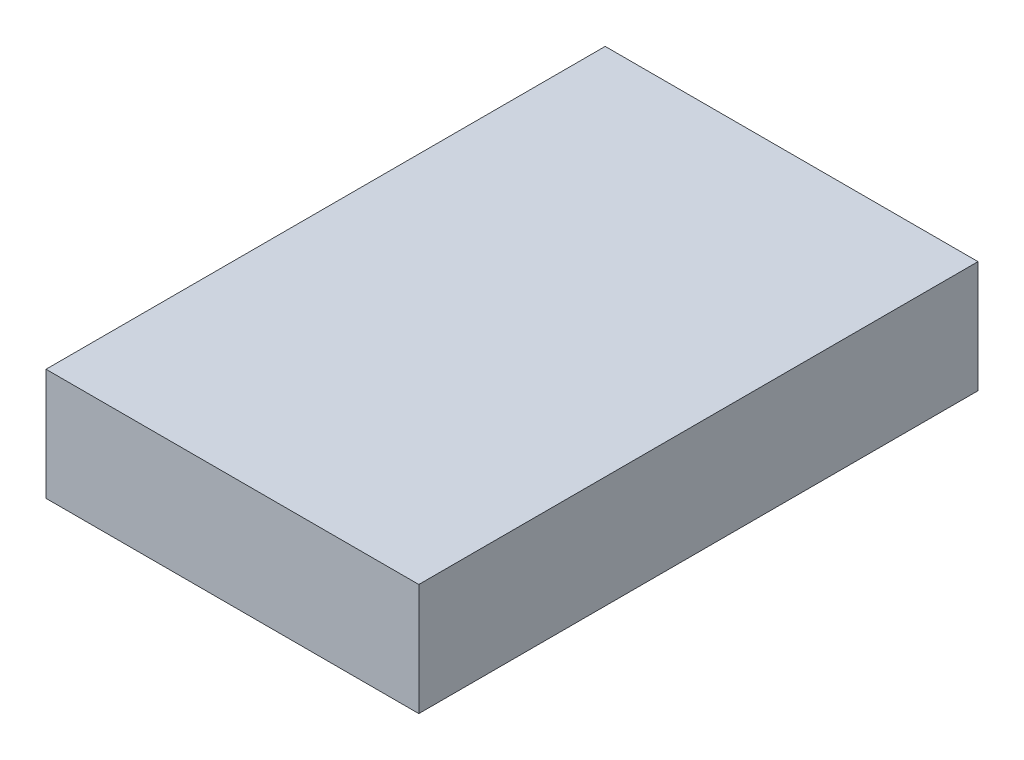
ISO-10303-21;
HEADER;
FILE_DESCRIPTION(('STEP AP214'),'2;1');
FILE_NAME('part.step','',(''),(''),'','','');
FILE_SCHEMA(('AUTOMOTIVE_DESIGN { 1 0 10303 214 1 1 1 1 }'));
ENDSEC;
DATA;
#1=APPLICATION_CONTEXT('core data for automotive mechanical design processes');
#2=APPLICATION_PROTOCOL_DEFINITION('international standard','automotive_design',2000,#1);
#3=PRODUCT_CONTEXT('',#1,'mechanical');
#4=PRODUCT('Part','Part','',(#3));
#5=PRODUCT_RELATED_PRODUCT_CATEGORY('part','',(#4));
#6=PRODUCT_DEFINITION_FORMATION('','',#4);
#7=PRODUCT_DEFINITION_CONTEXT('part definition',#1,'design');
#8=PRODUCT_DEFINITION('design','',#6,#7);
#9=PRODUCT_DEFINITION_SHAPE('','',#8);
#10=(LENGTH_UNIT() NAMED_UNIT(*) SI_UNIT(.MILLI.,.METRE.));
#11=(NAMED_UNIT(*) PLANE_ANGLE_UNIT() SI_UNIT($,.RADIAN.));
#12=(NAMED_UNIT(*) SI_UNIT($,.STERADIAN.) SOLID_ANGLE_UNIT());
#13=UNCERTAINTY_MEASURE_WITH_UNIT(LENGTH_MEASURE(1.E-05),#10,'distance_accuracy_value','');
#14=(GEOMETRIC_REPRESENTATION_CONTEXT(3) GLOBAL_UNCERTAINTY_ASSIGNED_CONTEXT((#13)) GLOBAL_UNIT_ASSIGNED_CONTEXT((#10,
#11,#12)) REPRESENTATION_CONTEXT('',''));
#15=CARTESIAN_POINT('',(0.,0.,0.));
#16=DIRECTION('',(0.,0.,1.));
#17=DIRECTION('',(1.,0.,0.));
#18=AXIS2_PLACEMENT_3D('',#15,#16,#17);
#19=CARTESIAN_POINT('',(25.,15.,37.5));
#20=DIRECTION('',(-1.,0.,0.));
#21=DIRECTION('',(0.,0.,1.));
#22=AXIS2_PLACEMENT_3D('',#19,#20,#21);
#23=PLANE('',#22);
#24=DIRECTION('',(0.,0.,-1.));
#25=VECTOR('',#24,1.);
#26=CARTESIAN_POINT('',(25.,0.,37.5));
#27=LINE('',#26,#25);
#28=CARTESIAN_POINT('',(25.,0.,37.5));
#29=VERTEX_POINT('',#28);
#30=CARTESIAN_POINT('',(25.,0.,-37.5));
#31=VERTEX_POINT('',#30);
#32=EDGE_CURVE('E107',#29,#31,#27,.T.);
#33=ORIENTED_EDGE('',*,*,#32,.T.);
#34=DIRECTION('',(0.,-1.,0.));
#35=VECTOR('',#34,1.);
#36=CARTESIAN_POINT('',(25.,15.,-37.5));
#37=LINE('',#36,#35);
#38=CARTESIAN_POINT('',(25.,15.,-37.5));
#39=VERTEX_POINT('',#38);
#40=EDGE_CURVE('E11',#39,#31,#37,.T.);
#41=ORIENTED_EDGE('',*,*,#40,.F.);
#42=DIRECTION('',(0.,0.,-1.));
#43=VECTOR('',#42,1.);
#44=CARTESIAN_POINT('',(25.,15.,37.5));
#45=LINE('',#44,#43);
#46=CARTESIAN_POINT('',(25.,15.,37.5));
#47=VERTEX_POINT('',#46);
#48=EDGE_CURVE('E91',#47,#39,#45,.T.);
#49=ORIENTED_EDGE('',*,*,#48,.F.);
#50=DIRECTION('',(0.,-1.,0.));
#51=VECTOR('',#50,1.);
#52=CARTESIAN_POINT('',(25.,15.,37.5));
#53=LINE('',#52,#51);
#54=EDGE_CURVE('E103',#47,#29,#53,.T.);
#55=ORIENTED_EDGE('',*,*,#54,.T.);
#56=EDGE_LOOP('',(#33,#41,#49,#55));
#57=FACE_BOUND('',#56,.T.);
#58=ADVANCED_FACE('F39',(#57),#23,.F.);
#59=CARTESIAN_POINT('',(-25.,15.,-37.5));
#60=DIRECTION('',(0.,0.,1.));
#61=DIRECTION('',(1.,0.,0.));
#62=AXIS2_PLACEMENT_3D('',#59,#60,#61);
#63=PLANE('',#62);
#64=DIRECTION('',(-1.,0.,0.));
#65=VECTOR('',#64,1.);
#66=CARTESIAN_POINT('',(-25.,0.,-37.5));
#67=LINE('',#66,#65);
#68=CARTESIAN_POINT('',(-25.,0.,-37.5));
#69=VERTEX_POINT('',#68);
#70=EDGE_CURVE('E96',#31,#69,#67,.T.);
#71=ORIENTED_EDGE('',*,*,#70,.T.);
#72=DIRECTION('',(0.,-1.,0.));
#73=VECTOR('',#72,1.);
#74=CARTESIAN_POINT('',(-25.,15.,-37.5));
#75=LINE('',#74,#73);
#76=CARTESIAN_POINT('',(-25.,15.,-37.5));
#77=VERTEX_POINT('',#76);
#78=EDGE_CURVE('E48',#77,#69,#75,.T.);
#79=ORIENTED_EDGE('',*,*,#78,.F.);
#80=DIRECTION('',(-1.,0.,0.));
#81=VECTOR('',#80,1.);
#82=CARTESIAN_POINT('',(-25.,15.,-37.5));
#83=LINE('',#82,#81);
#84=EDGE_CURVE('E86',#39,#77,#83,.T.);
#85=ORIENTED_EDGE('',*,*,#84,.F.);
#86=ORIENTED_EDGE('',*,*,#40,.T.);
#87=EDGE_LOOP('',(#71,#79,#85,#86));
#88=FACE_BOUND('',#87,.T.);
#89=ADVANCED_FACE('F95',(#88),#63,.F.);
#90=CARTESIAN_POINT('',(-25.,15.,37.5));
#91=DIRECTION('',(1.,0.,0.));
#92=DIRECTION('',(0.,0.,-1.));
#93=AXIS2_PLACEMENT_3D('',#90,#91,#92);
#94=PLANE('',#93);
#95=DIRECTION('',(0.,0.,1.));
#96=VECTOR('',#95,1.);
#97=CARTESIAN_POINT('',(-25.,0.,37.5));
#98=LINE('',#97,#96);
#99=CARTESIAN_POINT('',(-25.,0.,37.5));
#100=VERTEX_POINT('',#99);
#101=EDGE_CURVE('E73',#69,#100,#98,.T.);
#102=ORIENTED_EDGE('',*,*,#101,.T.);
#103=DIRECTION('',(0.,-1.,0.));
#104=VECTOR('',#103,1.);
#105=CARTESIAN_POINT('',(-25.,15.,37.5));
#106=LINE('',#105,#104);
#107=CARTESIAN_POINT('',(-25.,15.,37.5));
#108=VERTEX_POINT('',#107);
#109=EDGE_CURVE('E98',#108,#100,#106,.T.);
#110=ORIENTED_EDGE('',*,*,#109,.F.);
#111=DIRECTION('',(0.,0.,1.));
#112=VECTOR('',#111,1.);
#113=CARTESIAN_POINT('',(-25.,15.,37.5));
#114=LINE('',#113,#112);
#115=EDGE_CURVE('E89',#77,#108,#114,.T.);
#116=ORIENTED_EDGE('',*,*,#115,.F.);
#117=ORIENTED_EDGE('',*,*,#78,.T.);
#118=EDGE_LOOP('',(#102,#110,#116,#117));
#119=FACE_BOUND('',#118,.T.);
#120=ADVANCED_FACE('F99',(#119),#94,.F.);
#121=CARTESIAN_POINT('',(-25.,15.,37.5));
#122=DIRECTION('',(0.,0.,-1.));
#123=DIRECTION('',(-1.,0.,0.));
#124=AXIS2_PLACEMENT_3D('',#121,#122,#123);
#125=PLANE('',#124);
#126=DIRECTION('',(1.,0.,0.));
#127=VECTOR('',#126,1.);
#128=CARTESIAN_POINT('',(-25.,0.,37.5));
#129=LINE('',#128,#127);
#130=EDGE_CURVE('E79',#100,#29,#129,.T.);
#131=ORIENTED_EDGE('',*,*,#130,.T.);
#132=ORIENTED_EDGE('',*,*,#54,.F.);
#133=DIRECTION('',(1.,0.,0.));
#134=VECTOR('',#133,1.);
#135=CARTESIAN_POINT('',(-25.,15.,37.5));
#136=LINE('',#135,#134);
#137=EDGE_CURVE('E56',#108,#47,#136,.T.);
#138=ORIENTED_EDGE('',*,*,#137,.F.);
#139=ORIENTED_EDGE('',*,*,#109,.T.);
#140=EDGE_LOOP('',(#131,#132,#138,#139));
#141=FACE_BOUND('',#140,.T.);
#142=ADVANCED_FACE('F120',(#141),#125,.F.);
#143=CARTESIAN_POINT('',(0.,15.,0.));
#144=DIRECTION('',(0.,-1.,0.));
#145=DIRECTION('',(0.,0.,-1.));
#146=AXIS2_PLACEMENT_3D('',#143,#144,#145);
#147=PLANE('',#146);
#148=ORIENTED_EDGE('',*,*,#48,.T.);
#149=ORIENTED_EDGE('',*,*,#84,.T.);
#150=ORIENTED_EDGE('',*,*,#115,.T.);
#151=ORIENTED_EDGE('',*,*,#137,.T.);
#152=EDGE_LOOP('',(#148,#149,#150,#151));
#153=FACE_BOUND('',#152,.T.);
#154=ADVANCED_FACE('F87',(#153),#147,.F.);
#155=CARTESIAN_POINT('',(0.,0.,0.));
#156=DIRECTION('',(0.,-1.,0.));
#157=DIRECTION('',(0.,0.,-1.));
#158=AXIS2_PLACEMENT_3D('',#155,#156,#157);
#159=PLANE('',#158);
#160=ORIENTED_EDGE('',*,*,#32,.F.);
#161=ORIENTED_EDGE('',*,*,#130,.F.);
#162=ORIENTED_EDGE('',*,*,#101,.F.);
#163=ORIENTED_EDGE('',*,*,#70,.F.);
#164=EDGE_LOOP('',(#160,#161,#162,#163));
#165=FACE_BOUND('',#164,.T.);
#166=ADVANCED_FACE('F123',(#165),#159,.T.);
#167=CLOSED_SHELL('',(#58,#89,#120,#142,#154,#166));
#168=MANIFOLD_SOLID_BREP('B2',#167);
#169=ADVANCED_BREP_SHAPE_REPRESENTATION('',(#18,#168),#14);
#170=SHAPE_DEFINITION_REPRESENTATION(#9,#169);
ENDSEC;
END-ISO-10303-21;
